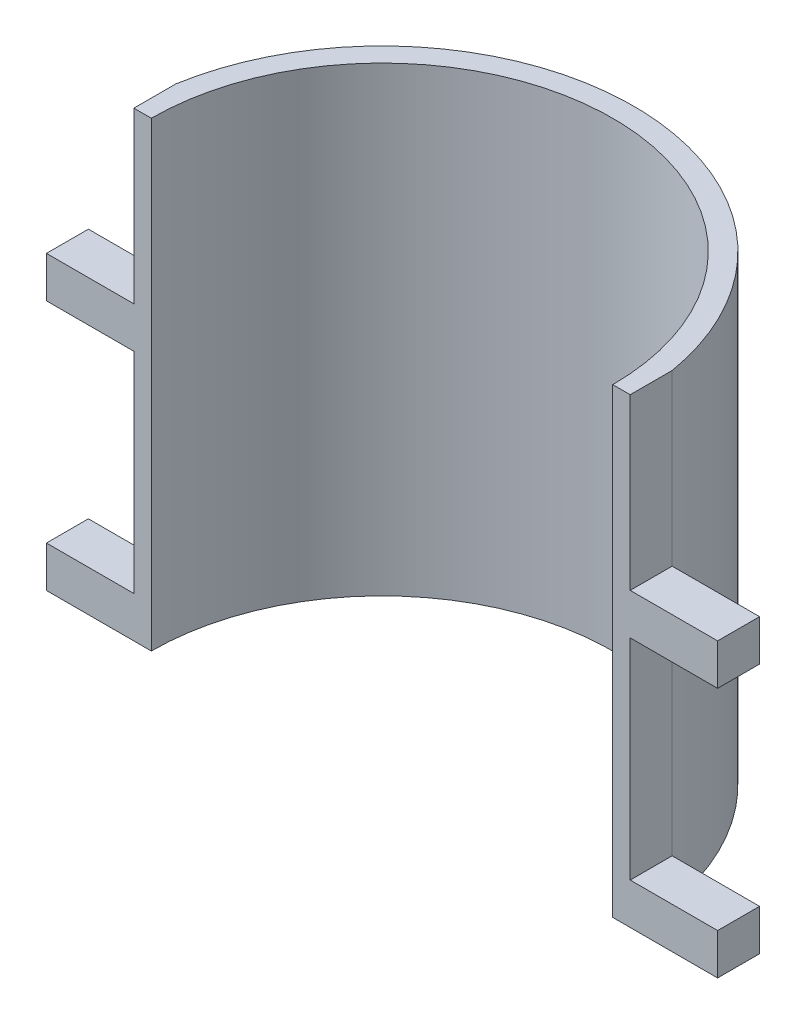
ISO-10303-21;
HEADER;
FILE_DESCRIPTION(('STEP AP214'),'2;1');
FILE_NAME('part.step','',(''),(''),'','','');
FILE_SCHEMA(('AUTOMOTIVE_DESIGN { 1 0 10303 214 1 1 1 1 }'));
ENDSEC;
DATA;
#1=APPLICATION_CONTEXT('core data for automotive mechanical design processes');
#2=APPLICATION_PROTOCOL_DEFINITION('international standard','automotive_design',2000,#1);
#3=PRODUCT_CONTEXT('',#1,'mechanical');
#4=PRODUCT('Part','Part','',(#3));
#5=PRODUCT_RELATED_PRODUCT_CATEGORY('part','',(#4));
#6=PRODUCT_DEFINITION_FORMATION('','',#4);
#7=PRODUCT_DEFINITION_CONTEXT('part definition',#1,'design');
#8=PRODUCT_DEFINITION('design','',#6,#7);
#9=PRODUCT_DEFINITION_SHAPE('','',#8);
#10=(LENGTH_UNIT() NAMED_UNIT(*) SI_UNIT(.MILLI.,.METRE.));
#11=(NAMED_UNIT(*) PLANE_ANGLE_UNIT() SI_UNIT($,.RADIAN.));
#12=(NAMED_UNIT(*) SI_UNIT($,.STERADIAN.) SOLID_ANGLE_UNIT());
#13=UNCERTAINTY_MEASURE_WITH_UNIT(LENGTH_MEASURE(1.E-05),#10,'distance_accuracy_value','');
#14=(GEOMETRIC_REPRESENTATION_CONTEXT(3) GLOBAL_UNCERTAINTY_ASSIGNED_CONTEXT((#13)) GLOBAL_UNIT_ASSIGNED_CONTEXT((#10,
#11,#12)) REPRESENTATION_CONTEXT('',''));
#15=CARTESIAN_POINT('',(0.,0.,0.));
#16=DIRECTION('',(0.,0.,1.));
#17=DIRECTION('',(1.,0.,0.));
#18=AXIS2_PLACEMENT_3D('',#15,#16,#17);
#19=CARTESIAN_POINT('',(0.,110.,-9.99999999999999));
#20=DIRECTION('',(0.,0.,1.));
#21=DIRECTION('',(1.,0.,0.));
#22=AXIS2_PLACEMENT_3D('',#19,#20,#21);
#23=PLANE('',#22);
#24=DIRECTION('',(-1.,0.,0.));
#25=VECTOR('',#24,1.);
#26=CARTESIAN_POINT('',(0.,59.8,-9.99999999999999));
#27=LINE('',#26,#25);
#28=CARTESIAN_POINT('',(-59.1607978309962,59.8,-9.99999999999998));
#29=VERTEX_POINT('',#28);
#30=CARTESIAN_POINT('',(-80.,59.8,-9.99999999999997));
#31=VERTEX_POINT('',#30);
#32=EDGE_CURVE('E231',#29,#31,#27,.T.);
#33=ORIENTED_EDGE('',*,*,#32,.T.);
#34=DIRECTION('',(0.,-1.,0.));
#35=VECTOR('',#34,1.);
#36=CARTESIAN_POINT('',(-80.,110.,-9.99999999999999));
#37=LINE('',#36,#35);
#38=CARTESIAN_POINT('',(-80.,69.6,-9.99999999999997));
#39=VERTEX_POINT('',#38);
#40=EDGE_CURVE('E201',#39,#31,#37,.T.);
#41=ORIENTED_EDGE('',*,*,#40,.F.);
#42=DIRECTION('',(-1.,0.,0.));
#43=VECTOR('',#42,1.);
#44=CARTESIAN_POINT('',(-59.1607978309962,69.6,-9.99999999999998));
#45=LINE('',#44,#43);
#46=CARTESIAN_POINT('',(-59.1607978309962,69.6,-9.99999999999998));
#47=VERTEX_POINT('',#46);
#48=EDGE_CURVE('E176',#47,#39,#45,.T.);
#49=ORIENTED_EDGE('',*,*,#48,.F.);
#50=DIRECTION('',(0.,-1.,0.));
#51=VECTOR('',#50,1.);
#52=CARTESIAN_POINT('',(-59.1607978309962,110.,-9.99999999999999));
#53=LINE('',#52,#51);
#54=EDGE_CURVE('E193',#47,#29,#53,.T.);
#55=ORIENTED_EDGE('',*,*,#54,.T.);
#56=EDGE_LOOP('',(#33,#41,#49,#55));
#57=FACE_BOUND('',#56,.T.);
#58=ADVANCED_FACE('F41',(#57),#23,.F.);
#59=CARTESIAN_POINT('',(-80.,110.,0.));
#60=DIRECTION('',(1.,0.,0.));
#61=DIRECTION('',(0.,0.,-1.));
#62=AXIS2_PLACEMENT_3D('',#59,#60,#61);
#63=PLANE('',#62);
#64=DIRECTION('',(0.,0.,-1.));
#65=VECTOR('',#64,1.);
#66=CARTESIAN_POINT('',(-80.,59.8,100.));
#67=LINE('',#66,#65);
#68=CARTESIAN_POINT('',(-80.,59.8,0.));
#69=VERTEX_POINT('',#68);
#70=EDGE_CURVE('E232',#69,#31,#67,.T.);
#71=ORIENTED_EDGE('',*,*,#70,.F.);
#72=DIRECTION('',(0.,-1.,0.));
#73=VECTOR('',#72,1.);
#74=CARTESIAN_POINT('',(-80.,110.,0.));
#75=LINE('',#74,#73);
#76=CARTESIAN_POINT('',(-80.,69.6,0.));
#77=VERTEX_POINT('',#76);
#78=EDGE_CURVE('E238',#77,#69,#75,.T.);
#79=ORIENTED_EDGE('',*,*,#78,.F.);
#80=DIRECTION('',(0.,0.,-1.));
#81=VECTOR('',#80,1.);
#82=CARTESIAN_POINT('',(-80.,69.6,100.));
#83=LINE('',#82,#81);
#84=EDGE_CURVE('E182',#77,#39,#83,.T.);
#85=ORIENTED_EDGE('',*,*,#84,.T.);
#86=ORIENTED_EDGE('',*,*,#40,.T.);
#87=EDGE_LOOP('',(#71,#79,#85,#86));
#88=FACE_BOUND('',#87,.T.);
#89=ADVANCED_FACE('F334',(#88),#63,.F.);
#90=CARTESIAN_POINT('',(0.,110.,0.));
#91=DIRECTION('',(0.,0.,1.));
#92=DIRECTION('',(1.,0.,0.));
#93=AXIS2_PLACEMENT_3D('',#90,#91,#92);
#94=PLANE('',#93);
#95=ORIENTED_EDGE('',*,*,#78,.T.);
#96=DIRECTION('',(1.,0.,0.));
#97=VECTOR('',#96,1.);
#98=CARTESIAN_POINT('',(0.,59.8,0.));
#99=LINE('',#98,#97);
#100=CARTESIAN_POINT('',(-59.1607978309962,59.8,0.));
#101=VERTEX_POINT('',#100);
#102=EDGE_CURVE('E11',#69,#101,#99,.T.);
#103=ORIENTED_EDGE('',*,*,#102,.T.);
#104=DIRECTION('',(0.,1.,0.));
#105=VECTOR('',#104,1.);
#106=CARTESIAN_POINT('',(-59.1607978309962,110.,0.));
#107=LINE('',#106,#105);
#108=CARTESIAN_POINT('',(-59.1607978309962,9.8,0.));
#109=VERTEX_POINT('',#108);
#110=EDGE_CURVE('E49',#109,#101,#107,.T.);
#111=ORIENTED_EDGE('',*,*,#110,.F.);
#112=DIRECTION('',(1.,0.,0.));
#113=VECTOR('',#112,1.);
#114=CARTESIAN_POINT('',(0.,9.8,0.));
#115=LINE('',#114,#113);
#116=CARTESIAN_POINT('',(-80.,9.8,0.));
#117=VERTEX_POINT('',#116);
#118=EDGE_CURVE('E218',#117,#109,#115,.T.);
#119=ORIENTED_EDGE('',*,*,#118,.F.);
#120=CARTESIAN_POINT('',(-80.,0.,0.));
#121=VERTEX_POINT('',#120);
#122=EDGE_CURVE('E240',#117,#121,#75,.T.);
#123=ORIENTED_EDGE('',*,*,#122,.T.);
#124=DIRECTION('',(-1.,0.,0.));
#125=VECTOR('',#124,1.);
#126=CARTESIAN_POINT('',(0.,0.,0.));
#127=LINE('',#126,#125);
#128=CARTESIAN_POINT('',(-55.,0.,0.));
#129=VERTEX_POINT('',#128);
#130=EDGE_CURVE('E270',#129,#121,#127,.T.);
#131=ORIENTED_EDGE('',*,*,#130,.F.);
#132=DIRECTION('',(0.,-1.,0.));
#133=VECTOR('',#132,1.);
#134=CARTESIAN_POINT('',(-55.,110.,0.));
#135=LINE('',#134,#133);
#136=CARTESIAN_POINT('',(-55.,110.,0.));
#137=VERTEX_POINT('',#136);
#138=EDGE_CURVE('E241',#137,#129,#135,.T.);
#139=ORIENTED_EDGE('',*,*,#138,.F.);
#140=DIRECTION('',(-1.,0.,0.));
#141=VECTOR('',#140,1.);
#142=CARTESIAN_POINT('',(0.,110.,0.));
#143=LINE('',#142,#141);
#144=CARTESIAN_POINT('',(-59.1607978309961,110.,0.));
#145=VERTEX_POINT('',#144);
#146=EDGE_CURVE('E288',#137,#145,#143,.T.);
#147=ORIENTED_EDGE('',*,*,#146,.T.);
#148=DIRECTION('',(0.,1.,0.));
#149=VECTOR('',#148,1.);
#150=CARTESIAN_POINT('',(-59.1607978309961,110.,0.));
#151=LINE('',#150,#149);
#152=CARTESIAN_POINT('',(-59.1607978309961,69.6,0.));
#153=VERTEX_POINT('',#152);
#154=EDGE_CURVE('E304',#153,#145,#151,.T.);
#155=ORIENTED_EDGE('',*,*,#154,.F.);
#156=DIRECTION('',(1.,0.,0.));
#157=VECTOR('',#156,1.);
#158=CARTESIAN_POINT('',(0.,69.6,0.));
#159=LINE('',#158,#157);
#160=EDGE_CURVE('E179',#77,#153,#159,.T.);
#161=ORIENTED_EDGE('',*,*,#160,.F.);
#162=EDGE_LOOP('',(#95,#103,#111,#119,#123,#131,#139,#147,#155,#161));
#163=FACE_BOUND('',#162,.T.);
#164=ADVANCED_FACE('F236',(#163),#94,.T.);
#165=CARTESIAN_POINT('',(80.,110.,0.));
#166=DIRECTION('',(1.,0.,0.));
#167=DIRECTION('',(0.,0.,-1.));
#168=AXIS2_PLACEMENT_3D('',#165,#166,#167);
#169=PLANE('',#168);
#170=DIRECTION('',(0.,0.,-1.));
#171=VECTOR('',#170,1.);
#172=CARTESIAN_POINT('',(80.,69.6,100.));
#173=LINE('',#172,#171);
#174=CARTESIAN_POINT('',(80.,69.6,0.));
#175=VERTEX_POINT('',#174);
#176=CARTESIAN_POINT('',(80.,69.6,-10.));
#177=VERTEX_POINT('',#176);
#178=EDGE_CURVE('E202',#175,#177,#173,.T.);
#179=ORIENTED_EDGE('',*,*,#178,.F.);
#180=DIRECTION('',(0.,-1.,0.));
#181=VECTOR('',#180,1.);
#182=CARTESIAN_POINT('',(80.,110.,0.));
#183=LINE('',#182,#181);
#184=CARTESIAN_POINT('',(80.,59.8,0.));
#185=VERTEX_POINT('',#184);
#186=EDGE_CURVE('E246',#175,#185,#183,.T.);
#187=ORIENTED_EDGE('',*,*,#186,.T.);
#188=DIRECTION('',(0.,0.,-1.));
#189=VECTOR('',#188,1.);
#190=CARTESIAN_POINT('',(80.,59.8,100.));
#191=LINE('',#190,#189);
#192=CARTESIAN_POINT('',(80.,59.8,-10.));
#193=VERTEX_POINT('',#192);
#194=EDGE_CURVE('E309',#185,#193,#191,.T.);
#195=ORIENTED_EDGE('',*,*,#194,.T.);
#196=DIRECTION('',(0.,-1.,0.));
#197=VECTOR('',#196,1.);
#198=CARTESIAN_POINT('',(80.,110.,-9.99999999999999));
#199=LINE('',#198,#197);
#200=EDGE_CURVE('E249',#177,#193,#199,.T.);
#201=ORIENTED_EDGE('',*,*,#200,.F.);
#202=EDGE_LOOP('',(#179,#187,#195,#201));
#203=FACE_BOUND('',#202,.T.);
#204=ADVANCED_FACE('F342',(#203),#169,.T.);
#205=CARTESIAN_POINT('',(0.,110.,-9.99999999999999));
#206=DIRECTION('',(0.,0.,-1.));
#207=DIRECTION('',(-1.,0.,0.));
#208=AXIS2_PLACEMENT_3D('',#205,#206,#207);
#209=PLANE('',#208);
#210=DIRECTION('',(-1.,0.,0.));
#211=VECTOR('',#210,1.);
#212=CARTESIAN_POINT('',(80.,69.6,-10.));
#213=LINE('',#212,#211);
#214=CARTESIAN_POINT('',(59.1607978309962,69.6,-10.));
#215=VERTEX_POINT('',#214);
#216=EDGE_CURVE('E233',#177,#215,#213,.T.);
#217=ORIENTED_EDGE('',*,*,#216,.F.);
#218=ORIENTED_EDGE('',*,*,#200,.T.);
#219=DIRECTION('',(-1.,0.,0.));
#220=VECTOR('',#219,1.);
#221=CARTESIAN_POINT('',(0.,59.8,-9.99999999999999));
#222=LINE('',#221,#220);
#223=CARTESIAN_POINT('',(59.1607978309962,59.8,-9.99999999999999));
#224=VERTEX_POINT('',#223);
#225=EDGE_CURVE('E318',#193,#224,#222,.T.);
#226=ORIENTED_EDGE('',*,*,#225,.T.);
#227=DIRECTION('',(0.,-1.,0.));
#228=VECTOR('',#227,1.);
#229=CARTESIAN_POINT('',(59.1607978309962,110.,-9.99999999999999));
#230=LINE('',#229,#228);
#231=EDGE_CURVE('E255',#215,#224,#230,.T.);
#232=ORIENTED_EDGE('',*,*,#231,.F.);
#233=EDGE_LOOP('',(#217,#218,#226,#232));
#234=FACE_BOUND('',#233,.T.);
#235=ADVANCED_FACE('F399',(#234),#209,.T.);
#236=CARTESIAN_POINT('',(0.,110.,0.));
#237=DIRECTION('',(0.,1.,0.));
#238=DIRECTION('',(0.,0.,1.));
#239=AXIS2_PLACEMENT_3D('',#236,#237,#238);
#240=PLANE('',#239);
#241=DIRECTION('',(-1.,0.,0.));
#242=VECTOR('',#241,1.);
#243=CARTESIAN_POINT('',(0.,110.,0.));
#244=LINE('',#243,#242);
#245=CARTESIAN_POINT('',(59.1607978309962,110.,0.));
#246=VERTEX_POINT('',#245);
#247=CARTESIAN_POINT('',(55.,110.,0.));
#248=VERTEX_POINT('',#247);
#249=EDGE_CURVE('E283',#246,#248,#244,.T.);
#250=ORIENTED_EDGE('',*,*,#249,.F.);
#251=DIRECTION('',(0.,0.,-1.));
#252=VECTOR('',#251,1.);
#253=CARTESIAN_POINT('',(59.1607978309962,110.,0.));
#254=LINE('',#253,#252);
#255=CARTESIAN_POINT('',(59.1607978309962,110.,-9.99999999999999));
#256=VERTEX_POINT('',#255);
#257=EDGE_CURVE('E214',#246,#256,#254,.T.);
#258=ORIENTED_EDGE('',*,*,#257,.T.);
#259=CARTESIAN_POINT('',(0.,110.,0.));
#260=DIRECTION('',(0.,1.,0.));
#261=DIRECTION('',(0.,0.,1.));
#262=AXIS2_PLACEMENT_3D('',#259,#260,#261);
#263=CIRCLE('',#262,60.);
#264=CARTESIAN_POINT('',(-59.1607978309961,110.,-9.99999999999998));
#265=VERTEX_POINT('',#264);
#266=EDGE_CURVE('E260',#265,#256,#263,.F.);
#267=ORIENTED_EDGE('',*,*,#266,.F.);
#268=DIRECTION('',(0.,0.,-1.));
#269=VECTOR('',#268,1.);
#270=CARTESIAN_POINT('',(-59.1607978309961,110.,0.));
#271=LINE('',#270,#269);
#272=EDGE_CURVE('E188',#145,#265,#271,.T.);
#273=ORIENTED_EDGE('',*,*,#272,.F.);
#274=ORIENTED_EDGE('',*,*,#146,.F.);
#275=CARTESIAN_POINT('',(0.,110.,0.));
#276=DIRECTION('',(0.,1.,0.));
#277=DIRECTION('',(0.,0.,1.));
#278=AXIS2_PLACEMENT_3D('',#275,#276,#277);
#279=CIRCLE('',#278,55.);
#280=EDGE_CURVE('E285',#248,#137,#279,.T.);
#281=ORIENTED_EDGE('',*,*,#280,.F.);
#282=EDGE_LOOP('',(#250,#258,#267,#273,#274,#281));
#283=FACE_BOUND('',#282,.T.);
#284=ADVANCED_FACE('F386',(#283),#240,.T.);
#285=CARTESIAN_POINT('',(0.,110.,0.));
#286=DIRECTION('',(0.,-1.,0.));
#287=DIRECTION('',(0.,0.,-1.));
#288=AXIS2_PLACEMENT_3D('',#285,#286,#287);
#289=CYLINDRICAL_SURFACE('',#288,60.);
#290=CARTESIAN_POINT('',(0.,0.,0.));
#291=DIRECTION('',(0.,1.,0.));
#292=DIRECTION('',(0.,0.,1.));
#293=AXIS2_PLACEMENT_3D('',#290,#291,#292);
#294=CIRCLE('',#293,60.);
#295=CARTESIAN_POINT('',(-59.1607978309962,0.,-9.99999999999999));
#296=VERTEX_POINT('',#295);
#297=CARTESIAN_POINT('',(59.1607978309962,0.,-9.99999999999999));
#298=VERTEX_POINT('',#297);
#299=EDGE_CURVE('E279',#296,#298,#294,.F.);
#300=ORIENTED_EDGE('',*,*,#299,.F.);
#301=CARTESIAN_POINT('',(-59.1607978309962,9.8,-9.99999999999998));
#302=VERTEX_POINT('',#301);
#303=EDGE_CURVE('E195',#302,#296,#53,.T.);
#304=ORIENTED_EDGE('',*,*,#303,.F.);
#305=DIRECTION('',(0.,-1.,0.));
#306=VECTOR('',#305,1.);
#307=CARTESIAN_POINT('',(-59.1607978309962,0.,-9.99999999999998));
#308=LINE('',#307,#306);
#309=EDGE_CURVE('E208',#29,#302,#308,.T.);
#310=ORIENTED_EDGE('',*,*,#309,.F.);
#311=ORIENTED_EDGE('',*,*,#54,.F.);
#312=EDGE_CURVE('E185',#265,#47,#53,.T.);
#313=ORIENTED_EDGE('',*,*,#312,.F.);
#314=ORIENTED_EDGE('',*,*,#266,.T.);
#315=EDGE_CURVE('E252',#256,#215,#230,.T.);
#316=ORIENTED_EDGE('',*,*,#315,.T.);
#317=ORIENTED_EDGE('',*,*,#231,.T.);
#318=DIRECTION('',(0.,-1.,0.));
#319=VECTOR('',#318,1.);
#320=CARTESIAN_POINT('',(59.1607978309962,0.,-10.));
#321=LINE('',#320,#319);
#322=CARTESIAN_POINT('',(59.1607978309962,9.8,-10.));
#323=VERTEX_POINT('',#322);
#324=EDGE_CURVE('E64',#224,#323,#321,.T.);
#325=ORIENTED_EDGE('',*,*,#324,.T.);
#326=EDGE_CURVE('E256',#323,#298,#230,.T.);
#327=ORIENTED_EDGE('',*,*,#326,.T.);
#328=EDGE_LOOP('',(#300,#304,#310,#311,#313,#314,#316,#317,#325,#327));
#329=FACE_BOUND('',#328,.T.);
#330=ADVANCED_FACE('F43',(#329),#289,.T.);
#331=CARTESIAN_POINT('',(-80.,9.8,-9.99999999999997));
#332=VERTEX_POINT('',#331);
#333=CARTESIAN_POINT('',(-80.,0.,-9.99999999999999));
#334=VERTEX_POINT('',#333);
#335=EDGE_CURVE('E211',#332,#334,#37,.T.);
#336=ORIENTED_EDGE('',*,*,#335,.F.);
#337=DIRECTION('',(-1.,0.,0.));
#338=VECTOR('',#337,1.);
#339=CARTESIAN_POINT('',(0.,9.8,-9.99999999999999));
#340=LINE('',#339,#338);
#341=EDGE_CURVE('E328',#302,#332,#340,.T.);
#342=ORIENTED_EDGE('',*,*,#341,.F.);
#343=ORIENTED_EDGE('',*,*,#303,.T.);
#344=DIRECTION('',(-1.,0.,0.));
#345=VECTOR('',#344,1.);
#346=CARTESIAN_POINT('',(0.,0.,-9.99999999999999));
#347=LINE('',#346,#345);
#348=EDGE_CURVE('E276',#296,#334,#347,.T.);
#349=ORIENTED_EDGE('',*,*,#348,.T.);
#350=EDGE_LOOP('',(#336,#342,#343,#349));
#351=FACE_BOUND('',#350,.T.);
#352=ADVANCED_FACE('F344',(#351),#23,.F.);
#353=ORIENTED_EDGE('',*,*,#122,.F.);
#354=DIRECTION('',(0.,0.,-1.));
#355=VECTOR('',#354,1.);
#356=CARTESIAN_POINT('',(-80.,9.8,100.));
#357=LINE('',#356,#355);
#358=EDGE_CURVE('E56',#117,#332,#357,.T.);
#359=ORIENTED_EDGE('',*,*,#358,.T.);
#360=ORIENTED_EDGE('',*,*,#335,.T.);
#361=DIRECTION('',(0.,0.,1.));
#362=VECTOR('',#361,1.);
#363=CARTESIAN_POINT('',(-80.,0.,0.));
#364=LINE('',#363,#362);
#365=EDGE_CURVE('E273',#334,#121,#364,.T.);
#366=ORIENTED_EDGE('',*,*,#365,.T.);
#367=EDGE_LOOP('',(#353,#359,#360,#366));
#368=FACE_BOUND('',#367,.T.);
#369=ADVANCED_FACE('F337',(#368),#63,.F.);
#370=CARTESIAN_POINT('',(0.,110.,0.));
#371=DIRECTION('',(0.,-1.,0.));
#372=DIRECTION('',(0.,0.,-1.));
#373=AXIS2_PLACEMENT_3D('',#370,#371,#372);
#374=CYLINDRICAL_SURFACE('',#373,55.);
#375=CARTESIAN_POINT('',(0.,0.,0.));
#376=DIRECTION('',(0.,1.,0.));
#377=DIRECTION('',(0.,0.,1.));
#378=AXIS2_PLACEMENT_3D('',#375,#376,#377);
#379=CIRCLE('',#378,55.);
#380=CARTESIAN_POINT('',(55.,0.,0.));
#381=VERTEX_POINT('',#380);
#382=EDGE_CURVE('E267',#381,#129,#379,.T.);
#383=ORIENTED_EDGE('',*,*,#382,.F.);
#384=DIRECTION('',(0.,-1.,0.));
#385=VECTOR('',#384,1.);
#386=CARTESIAN_POINT('',(55.,110.,0.));
#387=LINE('',#386,#385);
#388=EDGE_CURVE('E244',#248,#381,#387,.T.);
#389=ORIENTED_EDGE('',*,*,#388,.F.);
#390=ORIENTED_EDGE('',*,*,#280,.T.);
#391=ORIENTED_EDGE('',*,*,#138,.T.);
#392=EDGE_LOOP('',(#383,#389,#390,#391));
#393=FACE_BOUND('',#392,.T.);
#394=ADVANCED_FACE('F346',(#393),#374,.F.);
#395=CARTESIAN_POINT('',(0.,110.,0.));
#396=DIRECTION('',(0.,0.,1.));
#397=DIRECTION('',(1.,0.,0.));
#398=AXIS2_PLACEMENT_3D('',#395,#396,#397);
#399=PLANE('',#398);
#400=DIRECTION('',(1.,0.,0.));
#401=VECTOR('',#400,1.);
#402=CARTESIAN_POINT('',(0.,69.6,0.));
#403=LINE('',#402,#401);
#404=CARTESIAN_POINT('',(59.1607978309962,69.6,0.));
#405=VERTEX_POINT('',#404);
#406=EDGE_CURVE('E282',#405,#175,#403,.T.);
#407=ORIENTED_EDGE('',*,*,#406,.F.);
#408=DIRECTION('',(0.,1.,0.));
#409=VECTOR('',#408,1.);
#410=CARTESIAN_POINT('',(59.1607978309962,110.,0.));
#411=LINE('',#410,#409);
#412=EDGE_CURVE('E301',#405,#246,#411,.T.);
#413=ORIENTED_EDGE('',*,*,#412,.T.);
#414=ORIENTED_EDGE('',*,*,#249,.T.);
#415=ORIENTED_EDGE('',*,*,#388,.T.);
#416=DIRECTION('',(-1.,0.,0.));
#417=VECTOR('',#416,1.);
#418=CARTESIAN_POINT('',(0.,0.,0.));
#419=LINE('',#418,#417);
#420=CARTESIAN_POINT('',(80.,0.,0.));
#421=VERTEX_POINT('',#420);
#422=EDGE_CURVE('E264',#421,#381,#419,.T.);
#423=ORIENTED_EDGE('',*,*,#422,.F.);
#424=CARTESIAN_POINT('',(80.,9.8,0.));
#425=VERTEX_POINT('',#424);
#426=EDGE_CURVE('E247',#425,#421,#183,.T.);
#427=ORIENTED_EDGE('',*,*,#426,.F.);
#428=DIRECTION('',(1.,0.,0.));
#429=VECTOR('',#428,1.);
#430=CARTESIAN_POINT('',(0.,9.8,0.));
#431=LINE('',#430,#429);
#432=CARTESIAN_POINT('',(59.1607978309962,9.8,0.));
#433=VERTEX_POINT('',#432);
#434=EDGE_CURVE('E296',#433,#425,#431,.T.);
#435=ORIENTED_EDGE('',*,*,#434,.F.);
#436=DIRECTION('',(0.,1.,0.));
#437=VECTOR('',#436,1.);
#438=CARTESIAN_POINT('',(59.1607978309962,110.,0.));
#439=LINE('',#438,#437);
#440=CARTESIAN_POINT('',(59.1607978309962,59.8,0.));
#441=VERTEX_POINT('',#440);
#442=EDGE_CURVE('E293',#433,#441,#439,.T.);
#443=ORIENTED_EDGE('',*,*,#442,.T.);
#444=DIRECTION('',(1.,0.,0.));
#445=VECTOR('',#444,1.);
#446=CARTESIAN_POINT('',(0.,59.8,0.));
#447=LINE('',#446,#445);
#448=EDGE_CURVE('E298',#441,#185,#447,.T.);
#449=ORIENTED_EDGE('',*,*,#448,.T.);
#450=ORIENTED_EDGE('',*,*,#186,.F.);
#451=EDGE_LOOP('',(#407,#413,#414,#415,#423,#427,#435,#443,#449,#450));
#452=FACE_BOUND('',#451,.T.);
#453=ADVANCED_FACE('F352',(#452),#399,.T.);
#454=DIRECTION('',(0.,0.,-1.));
#455=VECTOR('',#454,1.);
#456=CARTESIAN_POINT('',(80.,9.8,100.));
#457=LINE('',#456,#455);
#458=CARTESIAN_POINT('',(80.,9.8,-10.));
#459=VERTEX_POINT('',#458);
#460=EDGE_CURVE('E313',#425,#459,#457,.T.);
#461=ORIENTED_EDGE('',*,*,#460,.F.);
#462=ORIENTED_EDGE('',*,*,#426,.T.);
#463=DIRECTION('',(0.,0.,1.));
#464=VECTOR('',#463,1.);
#465=CARTESIAN_POINT('',(80.,0.,0.));
#466=LINE('',#465,#464);
#467=CARTESIAN_POINT('',(80.,0.,-9.99999999999999));
#468=VERTEX_POINT('',#467);
#469=EDGE_CURVE('E261',#468,#421,#466,.T.);
#470=ORIENTED_EDGE('',*,*,#469,.F.);
#471=EDGE_CURVE('E250',#459,#468,#199,.T.);
#472=ORIENTED_EDGE('',*,*,#471,.F.);
#473=EDGE_LOOP('',(#461,#462,#470,#472));
#474=FACE_BOUND('',#473,.T.);
#475=ADVANCED_FACE('F374',(#474),#169,.T.);
#476=DIRECTION('',(-1.,0.,0.));
#477=VECTOR('',#476,1.);
#478=CARTESIAN_POINT('',(0.,9.8,-9.99999999999999));
#479=LINE('',#478,#477);
#480=EDGE_CURVE('E310',#459,#323,#479,.T.);
#481=ORIENTED_EDGE('',*,*,#480,.F.);
#482=ORIENTED_EDGE('',*,*,#471,.T.);
#483=DIRECTION('',(1.,0.,0.));
#484=VECTOR('',#483,1.);
#485=CARTESIAN_POINT('',(0.,0.,-9.99999999999999));
#486=LINE('',#485,#484);
#487=EDGE_CURVE('E257',#298,#468,#486,.T.);
#488=ORIENTED_EDGE('',*,*,#487,.F.);
#489=ORIENTED_EDGE('',*,*,#326,.F.);
#490=EDGE_LOOP('',(#481,#482,#488,#489));
#491=FACE_BOUND('',#490,.T.);
#492=ADVANCED_FACE('F369',(#491),#209,.T.);
#493=CARTESIAN_POINT('',(0.,0.,0.));
#494=DIRECTION('',(0.,1.,0.));
#495=DIRECTION('',(0.,0.,1.));
#496=AXIS2_PLACEMENT_3D('',#493,#494,#495);
#497=PLANE('',#496);
#498=ORIENTED_EDGE('',*,*,#299,.T.);
#499=ORIENTED_EDGE('',*,*,#487,.T.);
#500=ORIENTED_EDGE('',*,*,#469,.T.);
#501=ORIENTED_EDGE('',*,*,#422,.T.);
#502=ORIENTED_EDGE('',*,*,#382,.T.);
#503=ORIENTED_EDGE('',*,*,#130,.T.);
#504=ORIENTED_EDGE('',*,*,#365,.F.);
#505=ORIENTED_EDGE('',*,*,#348,.F.);
#506=EDGE_LOOP('',(#498,#499,#500,#501,#502,#503,#504,#505));
#507=FACE_BOUND('',#506,.T.);
#508=ADVANCED_FACE('F366',(#507),#497,.F.);
#509=CARTESIAN_POINT('',(-59.1607978309961,69.6,100.));
#510=DIRECTION('',(0.,-1.,0.));
#511=DIRECTION('',(0.,0.,-1.));
#512=AXIS2_PLACEMENT_3D('',#509,#510,#511);
#513=PLANE('',#512);
#514=ORIENTED_EDGE('',*,*,#160,.T.);
#515=DIRECTION('',(0.,0.,-1.));
#516=VECTOR('',#515,1.);
#517=CARTESIAN_POINT('',(-59.1607978309961,69.6,100.));
#518=LINE('',#517,#516);
#519=EDGE_CURVE('E172',#153,#47,#518,.T.);
#520=ORIENTED_EDGE('',*,*,#519,.T.);
#521=ORIENTED_EDGE('',*,*,#48,.T.);
#522=ORIENTED_EDGE('',*,*,#84,.F.);
#523=EDGE_LOOP('',(#514,#520,#521,#522));
#524=FACE_BOUND('',#523,.T.);
#525=ADVANCED_FACE('F174',(#524),#513,.F.);
#526=CARTESIAN_POINT('',(-59.1607978309961,110.,100.));
#527=DIRECTION('',(1.,0.,0.));
#528=DIRECTION('',(0.,0.,-1.));
#529=AXIS2_PLACEMENT_3D('',#526,#527,#528);
#530=PLANE('',#529);
#531=ORIENTED_EDGE('',*,*,#154,.T.);
#532=ORIENTED_EDGE('',*,*,#272,.T.);
#533=ORIENTED_EDGE('',*,*,#312,.T.);
#534=ORIENTED_EDGE('',*,*,#519,.F.);
#535=EDGE_LOOP('',(#531,#532,#533,#534));
#536=FACE_BOUND('',#535,.T.);
#537=ADVANCED_FACE('F186',(#536),#530,.F.);
#538=CARTESIAN_POINT('',(80.,69.6,100.));
#539=DIRECTION('',(0.,-1.,0.));
#540=DIRECTION('',(0.,0.,-1.));
#541=AXIS2_PLACEMENT_3D('',#538,#539,#540);
#542=PLANE('',#541);
#543=ORIENTED_EDGE('',*,*,#406,.T.);
#544=ORIENTED_EDGE('',*,*,#178,.T.);
#545=ORIENTED_EDGE('',*,*,#216,.T.);
#546=DIRECTION('',(0.,0.,-1.));
#547=VECTOR('',#546,1.);
#548=CARTESIAN_POINT('',(59.1607978309962,69.6,100.));
#549=LINE('',#548,#547);
#550=EDGE_CURVE('E324',#405,#215,#549,.T.);
#551=ORIENTED_EDGE('',*,*,#550,.F.);
#552=EDGE_LOOP('',(#543,#544,#545,#551));
#553=FACE_BOUND('',#552,.T.);
#554=ADVANCED_FACE('F394',(#553),#542,.F.);
#555=CARTESIAN_POINT('',(59.1607978309962,110.,100.));
#556=DIRECTION('',(1.,0.,0.));
#557=DIRECTION('',(0.,0.,-1.));
#558=AXIS2_PLACEMENT_3D('',#555,#556,#557);
#559=PLANE('',#558);
#560=ORIENTED_EDGE('',*,*,#550,.T.);
#561=ORIENTED_EDGE('',*,*,#315,.F.);
#562=ORIENTED_EDGE('',*,*,#257,.F.);
#563=ORIENTED_EDGE('',*,*,#412,.F.);
#564=EDGE_LOOP('',(#560,#561,#562,#563));
#565=FACE_BOUND('',#564,.T.);
#566=ADVANCED_FACE('F390',(#565),#559,.T.);
#567=CARTESIAN_POINT('',(59.1607978309962,0.,100.));
#568=DIRECTION('',(1.,0.,0.));
#569=DIRECTION('',(0.,0.,-1.));
#570=AXIS2_PLACEMENT_3D('',#567,#568,#569);
#571=PLANE('',#570);
#572=DIRECTION('',(0.,0.,-1.));
#573=VECTOR('',#572,1.);
#574=CARTESIAN_POINT('',(59.1607978309962,9.8,100.));
#575=LINE('',#574,#573);
#576=EDGE_CURVE('E306',#433,#323,#575,.T.);
#577=ORIENTED_EDGE('',*,*,#576,.T.);
#578=ORIENTED_EDGE('',*,*,#324,.F.);
#579=DIRECTION('',(0.,0.,-1.));
#580=VECTOR('',#579,1.);
#581=CARTESIAN_POINT('',(59.1607978309962,59.8,100.));
#582=LINE('',#581,#580);
#583=EDGE_CURVE('E307',#441,#224,#582,.T.);
#584=ORIENTED_EDGE('',*,*,#583,.F.);
#585=ORIENTED_EDGE('',*,*,#442,.F.);
#586=EDGE_LOOP('',(#577,#578,#584,#585));
#587=FACE_BOUND('',#586,.T.);
#588=ADVANCED_FACE('F405',(#587),#571,.T.);
#589=CARTESIAN_POINT('',(0.,9.8,100.));
#590=DIRECTION('',(0.,-1.,0.));
#591=DIRECTION('',(0.,0.,-1.));
#592=AXIS2_PLACEMENT_3D('',#589,#590,#591);
#593=PLANE('',#592);
#594=ORIENTED_EDGE('',*,*,#434,.T.);
#595=ORIENTED_EDGE('',*,*,#460,.T.);
#596=ORIENTED_EDGE('',*,*,#480,.T.);
#597=ORIENTED_EDGE('',*,*,#576,.F.);
#598=EDGE_LOOP('',(#594,#595,#596,#597));
#599=FACE_BOUND('',#598,.T.);
#600=ADVANCED_FACE('F408',(#599),#593,.F.);
#601=CARTESIAN_POINT('',(0.,59.8,100.));
#602=DIRECTION('',(0.,-1.,0.));
#603=DIRECTION('',(0.,0.,-1.));
#604=AXIS2_PLACEMENT_3D('',#601,#602,#603);
#605=PLANE('',#604);
#606=ORIENTED_EDGE('',*,*,#583,.T.);
#607=ORIENTED_EDGE('',*,*,#225,.F.);
#608=ORIENTED_EDGE('',*,*,#194,.F.);
#609=ORIENTED_EDGE('',*,*,#448,.F.);
#610=EDGE_LOOP('',(#606,#607,#608,#609));
#611=FACE_BOUND('',#610,.T.);
#612=ADVANCED_FACE('F401',(#611),#605,.T.);
#613=CARTESIAN_POINT('',(-59.1607978309961,0.,100.));
#614=DIRECTION('',(1.,0.,0.));
#615=DIRECTION('',(0.,0.,-1.));
#616=AXIS2_PLACEMENT_3D('',#613,#614,#615);
#617=PLANE('',#616);
#618=ORIENTED_EDGE('',*,*,#110,.T.);
#619=DIRECTION('',(0.,0.,-1.));
#620=VECTOR('',#619,1.);
#621=CARTESIAN_POINT('',(-59.1607978309961,59.8,100.));
#622=LINE('',#621,#620);
#623=EDGE_CURVE('E224',#101,#29,#622,.T.);
#624=ORIENTED_EDGE('',*,*,#623,.T.);
#625=ORIENTED_EDGE('',*,*,#309,.T.);
#626=DIRECTION('',(0.,0.,-1.));
#627=VECTOR('',#626,1.);
#628=CARTESIAN_POINT('',(-59.1607978309961,9.8,100.));
#629=LINE('',#628,#627);
#630=EDGE_CURVE('E226',#109,#302,#629,.T.);
#631=ORIENTED_EDGE('',*,*,#630,.F.);
#632=EDGE_LOOP('',(#618,#624,#625,#631));
#633=FACE_BOUND('',#632,.T.);
#634=ADVANCED_FACE('F223',(#633),#617,.F.);
#635=CARTESIAN_POINT('',(0.,59.8,100.));
#636=DIRECTION('',(0.,-1.,0.));
#637=DIRECTION('',(0.,0.,-1.));
#638=AXIS2_PLACEMENT_3D('',#635,#636,#637);
#639=PLANE('',#638);
#640=ORIENTED_EDGE('',*,*,#70,.T.);
#641=ORIENTED_EDGE('',*,*,#32,.F.);
#642=ORIENTED_EDGE('',*,*,#623,.F.);
#643=ORIENTED_EDGE('',*,*,#102,.F.);
#644=EDGE_LOOP('',(#640,#641,#642,#643));
#645=FACE_BOUND('',#644,.T.);
#646=ADVANCED_FACE('F229',(#645),#639,.T.);
#647=CARTESIAN_POINT('',(0.,9.8,100.));
#648=DIRECTION('',(0.,-1.,0.));
#649=DIRECTION('',(0.,0.,-1.));
#650=AXIS2_PLACEMENT_3D('',#647,#648,#649);
#651=PLANE('',#650);
#652=ORIENTED_EDGE('',*,*,#118,.T.);
#653=ORIENTED_EDGE('',*,*,#630,.T.);
#654=ORIENTED_EDGE('',*,*,#341,.T.);
#655=ORIENTED_EDGE('',*,*,#358,.F.);
#656=EDGE_LOOP('',(#652,#653,#654,#655));
#657=FACE_BOUND('',#656,.T.);
#658=ADVANCED_FACE('F360',(#657),#651,.F.);
#659=CLOSED_SHELL('',(#58,#89,#164,#204,#235,#284,#330,#352,#369,#394,#453,#475,#492,#508,#525,
#537,#554,#566,#588,#600,#612,#634,#646,#658));
#660=MANIFOLD_SOLID_BREP('B2',#659);
#661=ADVANCED_BREP_SHAPE_REPRESENTATION('',(#18,#660),#14);
#662=SHAPE_DEFINITION_REPRESENTATION(#9,#661);
ENDSEC;
END-ISO-10303-21;
